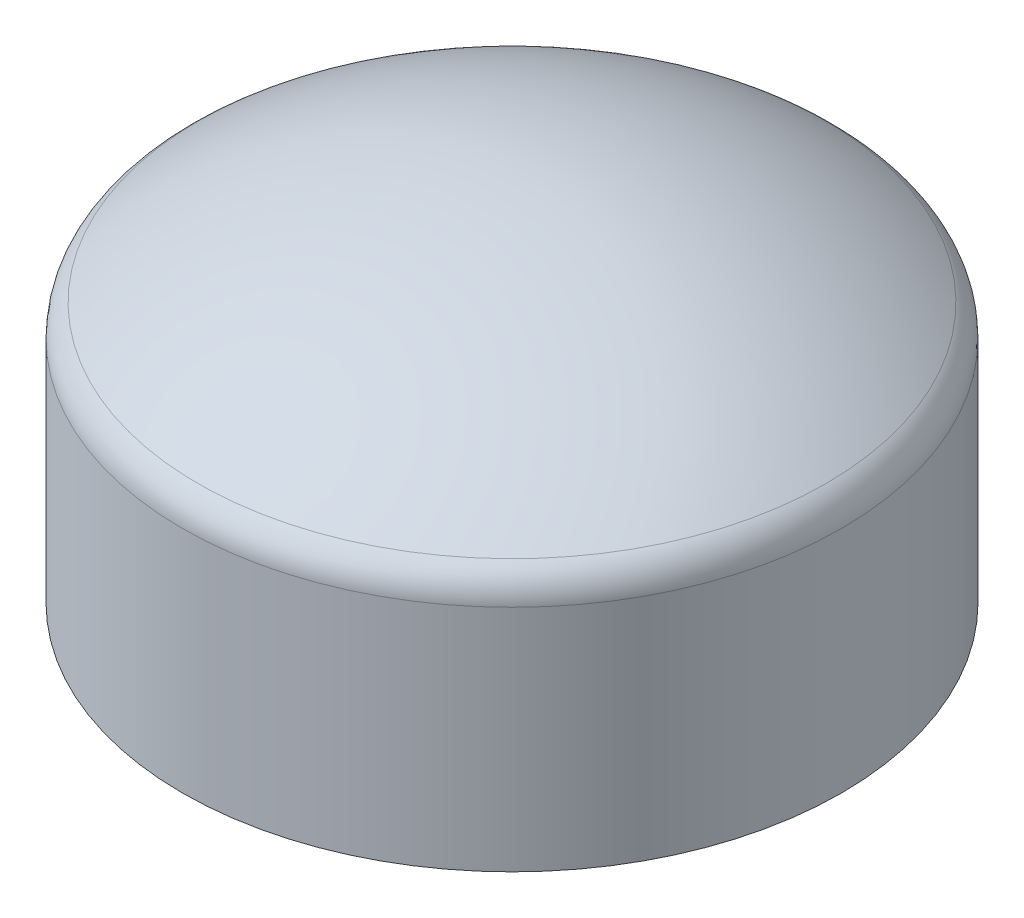
ISO-10303-21;
HEADER;
FILE_DESCRIPTION(('STEP AP214'),'2;1');
FILE_NAME('part.step','',(''),(''),'','','');
FILE_SCHEMA(('AUTOMOTIVE_DESIGN { 1 0 10303 214 1 1 1 1 }'));
ENDSEC;
DATA;
#1=APPLICATION_CONTEXT('core data for automotive mechanical design processes');
#2=APPLICATION_PROTOCOL_DEFINITION('international standard','automotive_design',2000,#1);
#3=PRODUCT_CONTEXT('',#1,'mechanical');
#4=PRODUCT('Part','Part','',(#3));
#5=PRODUCT_RELATED_PRODUCT_CATEGORY('part','',(#4));
#6=PRODUCT_DEFINITION_FORMATION('','',#4);
#7=PRODUCT_DEFINITION_CONTEXT('part definition',#1,'design');
#8=PRODUCT_DEFINITION('design','',#6,#7);
#9=PRODUCT_DEFINITION_SHAPE('','',#8);
#10=(LENGTH_UNIT() NAMED_UNIT(*) SI_UNIT(.MILLI.,.METRE.));
#11=(NAMED_UNIT(*) PLANE_ANGLE_UNIT() SI_UNIT($,.RADIAN.));
#12=(NAMED_UNIT(*) SI_UNIT($,.STERADIAN.) SOLID_ANGLE_UNIT());
#13=UNCERTAINTY_MEASURE_WITH_UNIT(LENGTH_MEASURE(1.E-05),#10,'distance_accuracy_value','');
#14=(GEOMETRIC_REPRESENTATION_CONTEXT(3) GLOBAL_UNCERTAINTY_ASSIGNED_CONTEXT((#13)) GLOBAL_UNIT_ASSIGNED_CONTEXT((#10,
#11,#12)) REPRESENTATION_CONTEXT('',''));
#15=CARTESIAN_POINT('',(0.,0.,0.));
#16=DIRECTION('',(0.,0.,1.));
#17=DIRECTION('',(1.,0.,0.));
#18=AXIS2_PLACEMENT_3D('',#15,#16,#17);
#19=CARTESIAN_POINT('',(0.,5.4,0.));
#20=DIRECTION('',(0.,-1.,0.));
#21=DIRECTION('',(1.,0.,0.));
#22=AXIS2_PLACEMENT_3D('',#19,#20,#21);
#23=CYLINDRICAL_SURFACE('',#22,6.5);
#24=CARTESIAN_POINT('',(0.,5.4,0.));
#25=DIRECTION('',(0.,-1.,0.));
#26=DIRECTION('',(1.,0.,0.));
#27=AXIS2_PLACEMENT_3D('',#24,#25,#26);
#28=CIRCLE('',#27,6.5);
#29=CARTESIAN_POINT('',(6.5,5.4,0.));
#30=VERTEX_POINT('',#29);
#31=EDGE_CURVE('E51',#30,#30,#28,.T.);
#32=ORIENTED_EDGE('',*,*,#31,.F.);
#33=EDGE_LOOP('',(#32));
#34=FACE_BOUND('',#33,.T.);
#35=CARTESIAN_POINT('',(0.,0.,0.));
#36=DIRECTION('',(0.,-1.,0.));
#37=DIRECTION('',(1.,0.,0.));
#38=AXIS2_PLACEMENT_3D('',#35,#36,#37);
#39=CIRCLE('',#38,6.5);
#40=CARTESIAN_POINT('',(6.5,0.,0.));
#41=VERTEX_POINT('',#40);
#42=EDGE_CURVE('E42',#41,#41,#39,.T.);
#43=ORIENTED_EDGE('',*,*,#42,.T.);
#44=EDGE_LOOP('',(#43));
#45=FACE_BOUND('',#44,.T.);
#46=ADVANCED_FACE('F31',(#34,#45),#23,.F.);
#47=CARTESIAN_POINT('',(-6.5,0.,0.));
#48=DIRECTION('',(0.,1.,0.));
#49=DIRECTION('',(-1.,0.,0.));
#50=AXIS2_PLACEMENT_3D('',#47,#48,#49);
#51=PLANE('',#50);
#52=ORIENTED_EDGE('',*,*,#42,.F.);
#53=EDGE_LOOP('',(#52));
#54=FACE_BOUND('',#53,.T.);
#55=CARTESIAN_POINT('',(0.,0.,0.));
#56=DIRECTION('',(0.,-1.,0.));
#57=DIRECTION('',(1.,0.,0.));
#58=AXIS2_PLACEMENT_3D('',#55,#56,#57);
#59=CIRCLE('',#58,8.5);
#60=CARTESIAN_POINT('',(8.5,0.,0.));
#61=VERTEX_POINT('',#60);
#62=EDGE_CURVE('E46',#61,#61,#59,.T.);
#63=ORIENTED_EDGE('',*,*,#62,.T.);
#64=EDGE_LOOP('',(#63));
#65=FACE_BOUND('',#64,.T.);
#66=ADVANCED_FACE('F59',(#54,#65),#51,.F.);
#67=CARTESIAN_POINT('',(0.,5.4,0.));
#68=DIRECTION('',(0.,-1.,0.));
#69=DIRECTION('',(1.,0.,0.));
#70=AXIS2_PLACEMENT_3D('',#67,#68,#69);
#71=CYLINDRICAL_SURFACE('',#70,8.5);
#72=CARTESIAN_POINT('',(0.,5.91036809141977,0.));
#73=DIRECTION('',(0.,-1.,0.));
#74=DIRECTION('',(1.,0.,0.));
#75=AXIS2_PLACEMENT_3D('',#72,#73,#74);
#76=CIRCLE('',#75,8.5);
#77=CARTESIAN_POINT('',(8.49999999999999,5.91036809141977,0.));
#78=VERTEX_POINT('',#77);
#79=EDGE_CURVE('E38',#78,#78,#76,.T.);
#80=ORIENTED_EDGE('',*,*,#79,.T.);
#81=EDGE_LOOP('',(#80));
#82=FACE_BOUND('',#81,.T.);
#83=ORIENTED_EDGE('',*,*,#62,.F.);
#84=EDGE_LOOP('',(#83));
#85=FACE_BOUND('',#84,.T.);
#86=ADVANCED_FACE('F64',(#82,#85),#71,.T.);
#87=CARTESIAN_POINT('',(0.,-4.14166666666666,0.));
#88=DIRECTION('',(0.,-1.,0.));
#89=DIRECTION('',(-1.,0.,0.));
#90=AXIS2_PLACEMENT_3D('',#87,#88,#89);
#91=SPHERICAL_SURFACE('',#90,13.5416666666667);
#92=CARTESIAN_POINT('',(0.,6.71185923492168,0.));
#93=DIRECTION('',(0.,-1.,0.));
#94=DIRECTION('',(1.,0.,0.));
#95=AXIS2_PLACEMENT_3D('',#92,#93,#94);
#96=CIRCLE('',#95,8.09800664451827);
#97=CARTESIAN_POINT('',(8.09800664451827,6.71185923492168,0.));
#98=VERTEX_POINT('',#97);
#99=EDGE_CURVE('E10',#98,#98,#96,.F.);
#100=ORIENTED_EDGE('',*,*,#99,.T.);
#101=EDGE_LOOP('',(#100));
#102=FACE_BOUND('',#101,.T.);
#103=ADVANCED_FACE('F69',(#102),#91,.T.);
#104=CARTESIAN_POINT('',(-6.5,5.4,0.));
#105=DIRECTION('',(0.,1.,0.));
#106=DIRECTION('',(-1.,0.,0.));
#107=AXIS2_PLACEMENT_3D('',#104,#105,#106);
#108=PLANE('',#107);
#109=ORIENTED_EDGE('',*,*,#31,.T.);
#110=EDGE_LOOP('',(#109));
#111=FACE_BOUND('',#110,.T.);
#112=ADVANCED_FACE('F55',(#111),#108,.F.);
#113=CARTESIAN_POINT('',(0.,5.91036809141977,0.));
#114=DIRECTION('',(0.,-1.,0.));
#115=DIRECTION('',(1.,0.,0.));
#116=AXIS2_PLACEMENT_3D('',#113,#114,#115);
#117=TOROIDAL_SURFACE('',#116,7.5,1.);
#118=ORIENTED_EDGE('',*,*,#99,.F.);
#119=EDGE_LOOP('',(#118));
#120=FACE_BOUND('',#119,.T.);
#121=ORIENTED_EDGE('',*,*,#79,.F.);
#122=EDGE_LOOP('',(#121));
#123=FACE_BOUND('',#122,.T.);
#124=ADVANCED_FACE('F33',(#120,#123),#117,.T.);
#125=CLOSED_SHELL('',(#46,#66,#86,#103,#112,#124));
#126=MANIFOLD_SOLID_BREP('B2',#125);
#127=ADVANCED_BREP_SHAPE_REPRESENTATION('',(#18,#126),#14);
#128=SHAPE_DEFINITION_REPRESENTATION(#9,#127);
ENDSEC;
END-ISO-10303-21;
